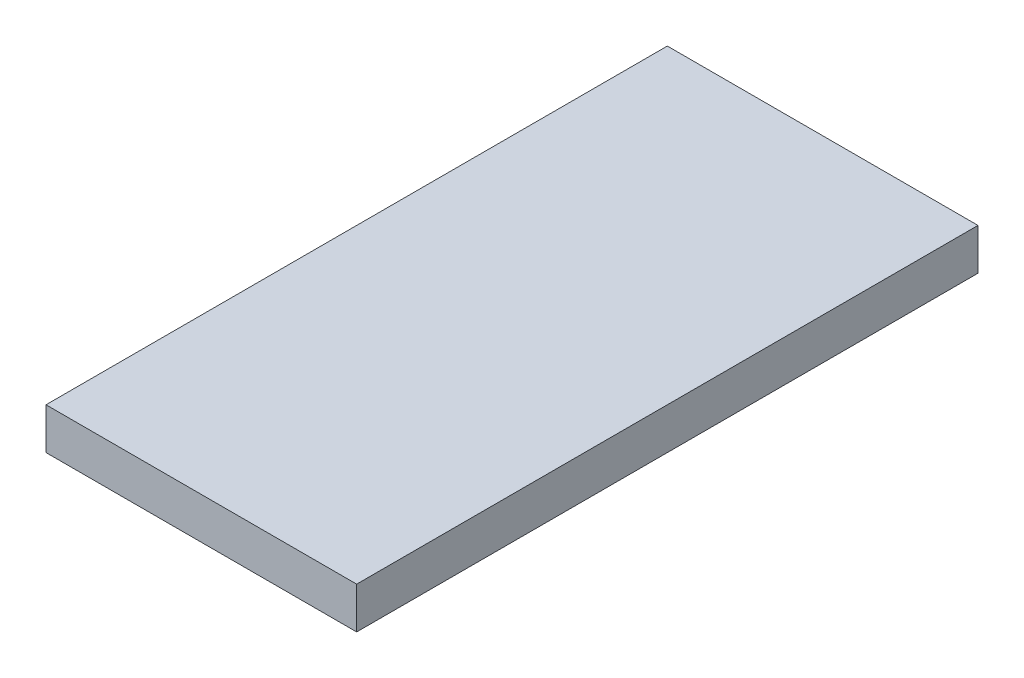
ISO-10303-21;
HEADER;
FILE_DESCRIPTION(('STEP AP214'),'2;1');
FILE_NAME('part.step','',(''),(''),'','','');
FILE_SCHEMA(('AUTOMOTIVE_DESIGN { 1 0 10303 214 1 1 1 1 }'));
ENDSEC;
DATA;
#1=APPLICATION_CONTEXT('core data for automotive mechanical design processes');
#2=APPLICATION_PROTOCOL_DEFINITION('international standard','automotive_design',2000,#1);
#3=PRODUCT_CONTEXT('',#1,'mechanical');
#4=PRODUCT('Part','Part','',(#3));
#5=PRODUCT_RELATED_PRODUCT_CATEGORY('part','',(#4));
#6=PRODUCT_DEFINITION_FORMATION('','',#4);
#7=PRODUCT_DEFINITION_CONTEXT('part definition',#1,'design');
#8=PRODUCT_DEFINITION('design','',#6,#7);
#9=PRODUCT_DEFINITION_SHAPE('','',#8);
#10=(LENGTH_UNIT() NAMED_UNIT(*) SI_UNIT(.MILLI.,.METRE.));
#11=(NAMED_UNIT(*) PLANE_ANGLE_UNIT() SI_UNIT($,.RADIAN.));
#12=(NAMED_UNIT(*) SI_UNIT($,.STERADIAN.) SOLID_ANGLE_UNIT());
#13=UNCERTAINTY_MEASURE_WITH_UNIT(LENGTH_MEASURE(1.E-05),#10,'distance_accuracy_value','');
#14=(GEOMETRIC_REPRESENTATION_CONTEXT(3) GLOBAL_UNCERTAINTY_ASSIGNED_CONTEXT((#13)) GLOBAL_UNIT_ASSIGNED_CONTEXT((#10,
#11,#12)) REPRESENTATION_CONTEXT('',''));
#15=CARTESIAN_POINT('',(0.,0.,0.));
#16=DIRECTION('',(0.,0.,1.));
#17=DIRECTION('',(1.,0.,0.));
#18=AXIS2_PLACEMENT_3D('',#15,#16,#17);
#19=CARTESIAN_POINT('',(0.,8.,120.));
#20=DIRECTION('',(1.,0.,0.));
#21=DIRECTION('',(0.,0.,-1.));
#22=AXIS2_PLACEMENT_3D('',#19,#20,#21);
#23=PLANE('',#22);
#24=DIRECTION('',(0.,-1.,0.));
#25=VECTOR('',#24,1.);
#26=CARTESIAN_POINT('',(0.,8.,0.));
#27=LINE('',#26,#25);
#28=CARTESIAN_POINT('',(0.,8.,0.));
#29=VERTEX_POINT('',#28);
#30=CARTESIAN_POINT('',(0.,0.,0.));
#31=VERTEX_POINT('',#30);
#32=EDGE_CURVE('E208',#29,#31,#27,.T.);
#33=ORIENTED_EDGE('',*,*,#32,.T.);
#34=DIRECTION('',(0.,0.,-1.));
#35=VECTOR('',#34,1.);
#36=CARTESIAN_POINT('',(0.,0.,120.));
#37=LINE('',#36,#35);
#38=CARTESIAN_POINT('',(0.,0.,120.));
#39=VERTEX_POINT('',#38);
#40=EDGE_CURVE('E11',#39,#31,#37,.T.);
#41=ORIENTED_EDGE('',*,*,#40,.F.);
#42=DIRECTION('',(0.,-1.,0.));
#43=VECTOR('',#42,1.);
#44=CARTESIAN_POINT('',(0.,8.,120.));
#45=LINE('',#44,#43);
#46=CARTESIAN_POINT('',(0.,8.,120.));
#47=VERTEX_POINT('',#46);
#48=EDGE_CURVE('E209',#47,#39,#45,.T.);
#49=ORIENTED_EDGE('',*,*,#48,.F.);
#50=DIRECTION('',(0.,0.,-1.));
#51=VECTOR('',#50,1.);
#52=CARTESIAN_POINT('',(0.,8.,120.));
#53=LINE('',#52,#51);
#54=EDGE_CURVE('E219',#47,#29,#53,.T.);
#55=ORIENTED_EDGE('',*,*,#54,.T.);
#56=EDGE_LOOP('',(#33,#41,#49,#55));
#57=FACE_BOUND('',#56,.T.);
#58=ADVANCED_FACE('F45',(#57),#23,.F.);
#59=CARTESIAN_POINT('',(0.,0.,120.));
#60=DIRECTION('',(0.,1.,0.));
#61=DIRECTION('',(0.,0.,1.));
#62=AXIS2_PLACEMENT_3D('',#59,#60,#61);
#63=PLANE('',#62);
#64=CARTESIAN_POINT('',(17.1014132027988,0.,20.));
#65=DIRECTION('',(0.,-1.,0.));
#66=DIRECTION('',(0.,0.,-1.));
#67=AXIS2_PLACEMENT_3D('',#64,#65,#66);
#68=CIRCLE('',#67,3.275);
#69=CARTESIAN_POINT('',(17.1014132027988,0.,16.725));
#70=VERTEX_POINT('',#69);
#71=EDGE_CURVE('E267',#70,#70,#68,.T.);
#72=ORIENTED_EDGE('',*,*,#71,.F.);
#73=EDGE_LOOP('',(#72));
#74=FACE_BOUND('',#73,.T.);
#75=CARTESIAN_POINT('',(17.1014132027985,0.,40.));
#76=DIRECTION('',(0.,-1.,0.));
#77=DIRECTION('',(0.,0.,-1.));
#78=AXIS2_PLACEMENT_3D('',#75,#76,#77);
#79=CIRCLE('',#78,3.275);
#80=CARTESIAN_POINT('',(17.1014132027985,0.,36.725));
#81=VERTEX_POINT('',#80);
#82=EDGE_CURVE('E120',#81,#81,#79,.T.);
#83=ORIENTED_EDGE('',*,*,#82,.F.);
#84=EDGE_LOOP('',(#83));
#85=FACE_BOUND('',#84,.T.);
#86=CARTESIAN_POINT('',(17.1014132027988,0.,60.));
#87=DIRECTION('',(0.,-1.,0.));
#88=DIRECTION('',(0.,0.,-1.));
#89=AXIS2_PLACEMENT_3D('',#86,#87,#88);
#90=CIRCLE('',#89,3.275);
#91=CARTESIAN_POINT('',(17.1014132027988,0.,56.725));
#92=VERTEX_POINT('',#91);
#93=EDGE_CURVE('E148',#92,#92,#90,.T.);
#94=ORIENTED_EDGE('',*,*,#93,.F.);
#95=EDGE_LOOP('',(#94));
#96=FACE_BOUND('',#95,.T.);
#97=CARTESIAN_POINT('',(17.1014132027985,0.,80.));
#98=DIRECTION('',(0.,-1.,0.));
#99=DIRECTION('',(0.,0.,-1.));
#100=AXIS2_PLACEMENT_3D('',#97,#98,#99);
#101=CIRCLE('',#100,3.275);
#102=CARTESIAN_POINT('',(17.1014132027985,0.,76.725));
#103=VERTEX_POINT('',#102);
#104=EDGE_CURVE('E168',#103,#103,#101,.T.);
#105=ORIENTED_EDGE('',*,*,#104,.F.);
#106=EDGE_LOOP('',(#105));
#107=FACE_BOUND('',#106,.T.);
#108=CARTESIAN_POINT('',(17.1014132027983,0.,100.));
#109=DIRECTION('',(0.,-1.,0.));
#110=DIRECTION('',(0.,0.,-1.));
#111=AXIS2_PLACEMENT_3D('',#108,#109,#110);
#112=CIRCLE('',#111,3.275);
#113=CARTESIAN_POINT('',(17.1014132027983,0.,96.725));
#114=VERTEX_POINT('',#113);
#115=EDGE_CURVE('E188',#114,#114,#112,.T.);
#116=ORIENTED_EDGE('',*,*,#115,.F.);
#117=EDGE_LOOP('',(#116));
#118=FACE_BOUND('',#117,.T.);
#119=DIRECTION('',(1.,0.,0.));
#120=VECTOR('',#119,1.);
#121=CARTESIAN_POINT('',(0.,0.,0.));
#122=LINE('',#121,#120);
#123=CARTESIAN_POINT('',(60.,0.,0.));
#124=VERTEX_POINT('',#123);
#125=EDGE_CURVE('E223',#31,#124,#122,.T.);
#126=ORIENTED_EDGE('',*,*,#125,.T.);
#127=DIRECTION('',(0.,0.,-1.));
#128=VECTOR('',#127,1.);
#129=CARTESIAN_POINT('',(60.,0.,120.));
#130=LINE('',#129,#128);
#131=CARTESIAN_POINT('',(60.,0.,120.));
#132=VERTEX_POINT('',#131);
#133=EDGE_CURVE('E54',#132,#124,#130,.T.);
#134=ORIENTED_EDGE('',*,*,#133,.F.);
#135=DIRECTION('',(1.,0.,0.));
#136=VECTOR('',#135,1.);
#137=CARTESIAN_POINT('',(0.,0.,120.));
#138=LINE('',#137,#136);
#139=EDGE_CURVE('E93',#39,#132,#138,.T.);
#140=ORIENTED_EDGE('',*,*,#139,.F.);
#141=ORIENTED_EDGE('',*,*,#40,.T.);
#142=EDGE_LOOP('',(#126,#134,#140,#141));
#143=FACE_BOUND('',#142,.T.);
#144=ADVANCED_FACE('F252',(#74,#85,#96,#107,#118,#143),#63,.F.);
#145=CARTESIAN_POINT('',(60.,0.,120.));
#146=DIRECTION('',(-1.,0.,0.));
#147=DIRECTION('',(0.,0.,1.));
#148=AXIS2_PLACEMENT_3D('',#145,#146,#147);
#149=PLANE('',#148);
#150=DIRECTION('',(0.,1.,0.));
#151=VECTOR('',#150,1.);
#152=CARTESIAN_POINT('',(60.,0.,0.));
#153=LINE('',#152,#151);
#154=CARTESIAN_POINT('',(60.,8.,0.));
#155=VERTEX_POINT('',#154);
#156=EDGE_CURVE('E80',#124,#155,#153,.T.);
#157=ORIENTED_EDGE('',*,*,#156,.T.);
#158=DIRECTION('',(0.,0.,-1.));
#159=VECTOR('',#158,1.);
#160=CARTESIAN_POINT('',(60.,8.,120.));
#161=LINE('',#160,#159);
#162=CARTESIAN_POINT('',(60.,8.,120.));
#163=VERTEX_POINT('',#162);
#164=EDGE_CURVE('E232',#163,#155,#161,.T.);
#165=ORIENTED_EDGE('',*,*,#164,.F.);
#166=DIRECTION('',(0.,1.,0.));
#167=VECTOR('',#166,1.);
#168=CARTESIAN_POINT('',(60.,0.,120.));
#169=LINE('',#168,#167);
#170=EDGE_CURVE('E214',#132,#163,#169,.T.);
#171=ORIENTED_EDGE('',*,*,#170,.F.);
#172=ORIENTED_EDGE('',*,*,#133,.T.);
#173=EDGE_LOOP('',(#157,#165,#171,#172));
#174=FACE_BOUND('',#173,.T.);
#175=ADVANCED_FACE('F236',(#174),#149,.F.);
#176=CARTESIAN_POINT('',(60.,8.,120.));
#177=DIRECTION('',(0.,-1.,0.));
#178=DIRECTION('',(0.,0.,-1.));
#179=AXIS2_PLACEMENT_3D('',#176,#177,#178);
#180=PLANE('',#179);
#181=DIRECTION('',(-1.,0.,0.));
#182=VECTOR('',#181,1.);
#183=CARTESIAN_POINT('',(60.,8.,0.));
#184=LINE('',#183,#182);
#185=EDGE_CURVE('E86',#155,#29,#184,.T.);
#186=ORIENTED_EDGE('',*,*,#185,.T.);
#187=ORIENTED_EDGE('',*,*,#54,.F.);
#188=DIRECTION('',(-1.,0.,0.));
#189=VECTOR('',#188,1.);
#190=CARTESIAN_POINT('',(60.,8.,120.));
#191=LINE('',#190,#189);
#192=EDGE_CURVE('E62',#163,#47,#191,.T.);
#193=ORIENTED_EDGE('',*,*,#192,.F.);
#194=ORIENTED_EDGE('',*,*,#164,.T.);
#195=EDGE_LOOP('',(#186,#187,#193,#194));
#196=FACE_BOUND('',#195,.T.);
#197=ADVANCED_FACE('F243',(#196),#180,.F.);
#198=CARTESIAN_POINT('',(0.,0.,120.));
#199=DIRECTION('',(0.,0.,1.));
#200=DIRECTION('',(1.,0.,0.));
#201=AXIS2_PLACEMENT_3D('',#198,#199,#200);
#202=PLANE('',#201);
#203=ORIENTED_EDGE('',*,*,#48,.T.);
#204=ORIENTED_EDGE('',*,*,#139,.T.);
#205=ORIENTED_EDGE('',*,*,#170,.T.);
#206=ORIENTED_EDGE('',*,*,#192,.T.);
#207=EDGE_LOOP('',(#203,#204,#205,#206));
#208=FACE_BOUND('',#207,.T.);
#209=ADVANCED_FACE('F245',(#208),#202,.T.);
#210=CARTESIAN_POINT('',(0.,0.,0.));
#211=DIRECTION('',(0.,0.,1.));
#212=DIRECTION('',(1.,0.,0.));
#213=AXIS2_PLACEMENT_3D('',#210,#211,#212);
#214=PLANE('',#213);
#215=ORIENTED_EDGE('',*,*,#32,.F.);
#216=ORIENTED_EDGE('',*,*,#185,.F.);
#217=ORIENTED_EDGE('',*,*,#156,.F.);
#218=ORIENTED_EDGE('',*,*,#125,.F.);
#219=EDGE_LOOP('',(#215,#216,#217,#218));
#220=FACE_BOUND('',#219,.T.);
#221=ADVANCED_FACE('F239',(#220),#214,.F.);
#222=CARTESIAN_POINT('',(17.1014132027983,6.,100.));
#223=DIRECTION('',(0.,-1.,0.));
#224=DIRECTION('',(0.,0.,-1.));
#225=AXIS2_PLACEMENT_3D('',#222,#223,#224);
#226=CONICAL_SURFACE('',#225,1.7,1.02974425867665);
#227=CARTESIAN_POINT('',(17.1014132027983,7.02146305234685,100.));
#228=VERTEX_POINT('',#227);
#229=VERTEX_LOOP('',#228);
#230=FACE_BOUND('',#229,.T.);
#231=CARTESIAN_POINT('',(17.1014132027983,6.,100.));
#232=DIRECTION('',(0.,-1.,0.));
#233=DIRECTION('',(0.,0.,-1.));
#234=AXIS2_PLACEMENT_3D('',#231,#232,#233);
#235=CIRCLE('',#234,1.7);
#236=CARTESIAN_POINT('',(17.1014132027983,6.,98.3));
#237=VERTEX_POINT('',#236);
#238=EDGE_CURVE('E204',#237,#237,#235,.T.);
#239=ORIENTED_EDGE('',*,*,#238,.T.);
#240=EDGE_LOOP('',(#239));
#241=FACE_BOUND('',#240,.T.);
#242=ADVANCED_FACE('F301',(#230,#241),#226,.F.);
#243=CARTESIAN_POINT('',(17.1014132027983,0.,100.));
#244=DIRECTION('',(0.,-1.,0.));
#245=DIRECTION('',(0.,0.,-1.));
#246=AXIS2_PLACEMENT_3D('',#243,#244,#245);
#247=CYLINDRICAL_SURFACE('',#246,1.7);
#248=ORIENTED_EDGE('',*,*,#238,.F.);
#249=EDGE_LOOP('',(#248));
#250=FACE_BOUND('',#249,.T.);
#251=CARTESIAN_POINT('',(17.1014132027983,3.4,100.));
#252=DIRECTION('',(0.,-1.,0.));
#253=DIRECTION('',(0.,0.,-1.));
#254=AXIS2_PLACEMENT_3D('',#251,#252,#253);
#255=CIRCLE('',#254,1.7);
#256=CARTESIAN_POINT('',(17.1014132027983,3.4,98.3));
#257=VERTEX_POINT('',#256);
#258=EDGE_CURVE('E200',#257,#257,#255,.T.);
#259=ORIENTED_EDGE('',*,*,#258,.T.);
#260=EDGE_LOOP('',(#259));
#261=FACE_BOUND('',#260,.T.);
#262=ADVANCED_FACE('F297',(#250,#261),#247,.F.);
#263=CARTESIAN_POINT('',(18.8014132027983,3.4,100.));
#264=DIRECTION('',(0.,1.,0.));
#265=DIRECTION('',(0.,0.,1.));
#266=AXIS2_PLACEMENT_3D('',#263,#264,#265);
#267=PLANE('',#266);
#268=ORIENTED_EDGE('',*,*,#258,.F.);
#269=EDGE_LOOP('',(#268));
#270=FACE_BOUND('',#269,.T.);
#271=CARTESIAN_POINT('',(17.1014132027983,3.4,100.));
#272=DIRECTION('',(0.,-1.,0.));
#273=DIRECTION('',(0.,0.,-1.));
#274=AXIS2_PLACEMENT_3D('',#271,#272,#273);
#275=CIRCLE('',#274,3.25);
#276=CARTESIAN_POINT('',(17.1014132027983,3.4,96.75));
#277=VERTEX_POINT('',#276);
#278=EDGE_CURVE('E196',#277,#277,#275,.T.);
#279=ORIENTED_EDGE('',*,*,#278,.T.);
#280=EDGE_LOOP('',(#279));
#281=FACE_BOUND('',#280,.T.);
#282=ADVANCED_FACE('F289',(#270,#281),#267,.F.);
#283=CARTESIAN_POINT('',(17.1014132027983,0.,100.));
#284=DIRECTION('',(0.,-1.,0.));
#285=DIRECTION('',(0.,0.,-1.));
#286=AXIS2_PLACEMENT_3D('',#283,#284,#285);
#287=CYLINDRICAL_SURFACE('',#286,3.25);
#288=ORIENTED_EDGE('',*,*,#278,.F.);
#289=EDGE_LOOP('',(#288));
#290=FACE_BOUND('',#289,.T.);
#291=CARTESIAN_POINT('',(17.1014132027983,0.0250000000000009,100.));
#292=DIRECTION('',(0.,-1.,0.));
#293=DIRECTION('',(0.,0.,-1.));
#294=AXIS2_PLACEMENT_3D('',#291,#292,#293);
#295=CIRCLE('',#294,3.25);
#296=CARTESIAN_POINT('',(17.1014132027983,0.0250000000000009,96.75));
#297=VERTEX_POINT('',#296);
#298=EDGE_CURVE('E192',#297,#297,#295,.T.);
#299=ORIENTED_EDGE('',*,*,#298,.T.);
#300=EDGE_LOOP('',(#299));
#301=FACE_BOUND('',#300,.T.);
#302=ADVANCED_FACE('F279',(#290,#301),#287,.F.);
#303=CARTESIAN_POINT('',(17.1014132027983,0.,100.));
#304=DIRECTION('',(0.,-1.,0.));
#305=DIRECTION('',(0.,0.,-1.));
#306=AXIS2_PLACEMENT_3D('',#303,#304,#305);
#307=CONICAL_SURFACE('',#306,3.275,0.785398163397444);
#308=ORIENTED_EDGE('',*,*,#298,.F.);
#309=EDGE_LOOP('',(#308));
#310=FACE_BOUND('',#309,.T.);
#311=ORIENTED_EDGE('',*,*,#115,.T.);
#312=EDGE_LOOP('',(#311));
#313=FACE_BOUND('',#312,.T.);
#314=ADVANCED_FACE('F276',(#310,#313),#307,.F.);
#315=CARTESIAN_POINT('',(17.1014132027985,6.,80.));
#316=DIRECTION('',(0.,-1.,0.));
#317=DIRECTION('',(0.,0.,-1.));
#318=AXIS2_PLACEMENT_3D('',#315,#316,#317);
#319=CONICAL_SURFACE('',#318,1.7,1.02974425867665);
#320=CARTESIAN_POINT('',(17.1014132027985,7.02146305234685,80.));
#321=VERTEX_POINT('',#320);
#322=VERTEX_LOOP('',#321);
#323=FACE_BOUND('',#322,.T.);
#324=CARTESIAN_POINT('',(17.1014132027985,6.,80.));
#325=DIRECTION('',(0.,-1.,0.));
#326=DIRECTION('',(0.,0.,-1.));
#327=AXIS2_PLACEMENT_3D('',#324,#325,#326);
#328=CIRCLE('',#327,1.7);
#329=CARTESIAN_POINT('',(17.1014132027985,6.,78.3));
#330=VERTEX_POINT('',#329);
#331=EDGE_CURVE('E184',#330,#330,#328,.T.);
#332=ORIENTED_EDGE('',*,*,#331,.T.);
#333=EDGE_LOOP('',(#332));
#334=FACE_BOUND('',#333,.T.);
#335=ADVANCED_FACE('F278',(#323,#334),#319,.F.);
#336=CARTESIAN_POINT('',(17.1014132027985,0.,80.));
#337=DIRECTION('',(0.,-1.,0.));
#338=DIRECTION('',(0.,0.,-1.));
#339=AXIS2_PLACEMENT_3D('',#336,#337,#338);
#340=CYLINDRICAL_SURFACE('',#339,1.7);
#341=ORIENTED_EDGE('',*,*,#331,.F.);
#342=EDGE_LOOP('',(#341));
#343=FACE_BOUND('',#342,.T.);
#344=CARTESIAN_POINT('',(17.1014132027985,3.4,80.));
#345=DIRECTION('',(0.,-1.,0.));
#346=DIRECTION('',(0.,0.,-1.));
#347=AXIS2_PLACEMENT_3D('',#344,#345,#346);
#348=CIRCLE('',#347,1.7);
#349=CARTESIAN_POINT('',(17.1014132027985,3.4,78.3));
#350=VERTEX_POINT('',#349);
#351=EDGE_CURVE('E180',#350,#350,#348,.T.);
#352=ORIENTED_EDGE('',*,*,#351,.T.);
#353=EDGE_LOOP('',(#352));
#354=FACE_BOUND('',#353,.T.);
#355=ADVANCED_FACE('F286',(#343,#354),#340,.F.);
#356=CARTESIAN_POINT('',(18.8014132027985,3.4,80.));
#357=DIRECTION('',(0.,1.,0.));
#358=DIRECTION('',(0.,0.,1.));
#359=AXIS2_PLACEMENT_3D('',#356,#357,#358);
#360=PLANE('',#359);
#361=ORIENTED_EDGE('',*,*,#351,.F.);
#362=EDGE_LOOP('',(#361));
#363=FACE_BOUND('',#362,.T.);
#364=CARTESIAN_POINT('',(17.1014132027985,3.4,80.));
#365=DIRECTION('',(0.,-1.,0.));
#366=DIRECTION('',(0.,0.,-1.));
#367=AXIS2_PLACEMENT_3D('',#364,#365,#366);
#368=CIRCLE('',#367,3.25);
#369=CARTESIAN_POINT('',(17.1014132027985,3.4,76.75));
#370=VERTEX_POINT('',#369);
#371=EDGE_CURVE('E176',#370,#370,#368,.T.);
#372=ORIENTED_EDGE('',*,*,#371,.T.);
#373=EDGE_LOOP('',(#372));
#374=FACE_BOUND('',#373,.T.);
#375=ADVANCED_FACE('F368',(#363,#374),#360,.F.);
#376=CARTESIAN_POINT('',(17.1014132027985,0.,80.));
#377=DIRECTION('',(0.,-1.,0.));
#378=DIRECTION('',(0.,0.,-1.));
#379=AXIS2_PLACEMENT_3D('',#376,#377,#378);
#380=CYLINDRICAL_SURFACE('',#379,3.25);
#381=ORIENTED_EDGE('',*,*,#371,.F.);
#382=EDGE_LOOP('',(#381));
#383=FACE_BOUND('',#382,.T.);
#384=CARTESIAN_POINT('',(17.1014132027985,0.0250000000000009,80.));
#385=DIRECTION('',(0.,-1.,0.));
#386=DIRECTION('',(0.,0.,-1.));
#387=AXIS2_PLACEMENT_3D('',#384,#385,#386);
#388=CIRCLE('',#387,3.25);
#389=CARTESIAN_POINT('',(17.1014132027985,0.0250000000000009,76.75));
#390=VERTEX_POINT('',#389);
#391=EDGE_CURVE('E172',#390,#390,#388,.T.);
#392=ORIENTED_EDGE('',*,*,#391,.T.);
#393=EDGE_LOOP('',(#392));
#394=FACE_BOUND('',#393,.T.);
#395=ADVANCED_FACE('F376',(#383,#394),#380,.F.);
#396=CARTESIAN_POINT('',(17.1014132027985,0.,80.));
#397=DIRECTION('',(0.,-1.,0.));
#398=DIRECTION('',(0.,0.,-1.));
#399=AXIS2_PLACEMENT_3D('',#396,#397,#398);
#400=CONICAL_SURFACE('',#399,3.275,0.785398163397444);
#401=ORIENTED_EDGE('',*,*,#391,.F.);
#402=EDGE_LOOP('',(#401));
#403=FACE_BOUND('',#402,.T.);
#404=ORIENTED_EDGE('',*,*,#104,.T.);
#405=EDGE_LOOP('',(#404));
#406=FACE_BOUND('',#405,.T.);
#407=ADVANCED_FACE('F385',(#403,#406),#400,.F.);
#408=CARTESIAN_POINT('',(17.1014132027988,6.,60.));
#409=DIRECTION('',(0.,-1.,0.));
#410=DIRECTION('',(0.,0.,-1.));
#411=AXIS2_PLACEMENT_3D('',#408,#409,#410);
#412=CONICAL_SURFACE('',#411,1.7,1.02974425867665);
#413=CARTESIAN_POINT('',(17.1014132027988,7.02146305234685,60.));
#414=VERTEX_POINT('',#413);
#415=VERTEX_LOOP('',#414);
#416=FACE_BOUND('',#415,.T.);
#417=CARTESIAN_POINT('',(17.1014132027988,6.,60.));
#418=DIRECTION('',(0.,-1.,0.));
#419=DIRECTION('',(0.,0.,-1.));
#420=AXIS2_PLACEMENT_3D('',#417,#418,#419);
#421=CIRCLE('',#420,1.7);
#422=CARTESIAN_POINT('',(17.1014132027988,6.,58.3));
#423=VERTEX_POINT('',#422);
#424=EDGE_CURVE('E164',#423,#423,#421,.T.);
#425=ORIENTED_EDGE('',*,*,#424,.T.);
#426=EDGE_LOOP('',(#425));
#427=FACE_BOUND('',#426,.T.);
#428=ADVANCED_FACE('F394',(#416,#427),#412,.F.);
#429=CARTESIAN_POINT('',(17.1014132027988,0.,60.));
#430=DIRECTION('',(0.,-1.,0.));
#431=DIRECTION('',(0.,0.,-1.));
#432=AXIS2_PLACEMENT_3D('',#429,#430,#431);
#433=CYLINDRICAL_SURFACE('',#432,1.7);
#434=ORIENTED_EDGE('',*,*,#424,.F.);
#435=EDGE_LOOP('',(#434));
#436=FACE_BOUND('',#435,.T.);
#437=CARTESIAN_POINT('',(17.1014132027988,3.4,60.));
#438=DIRECTION('',(0.,-1.,0.));
#439=DIRECTION('',(0.,0.,-1.));
#440=AXIS2_PLACEMENT_3D('',#437,#438,#439);
#441=CIRCLE('',#440,1.7);
#442=CARTESIAN_POINT('',(17.1014132027988,3.4,58.3));
#443=VERTEX_POINT('',#442);
#444=EDGE_CURVE('E160',#443,#443,#441,.T.);
#445=ORIENTED_EDGE('',*,*,#444,.T.);
#446=EDGE_LOOP('',(#445));
#447=FACE_BOUND('',#446,.T.);
#448=ADVANCED_FACE('F403',(#436,#447),#433,.F.);
#449=CARTESIAN_POINT('',(18.8014132027988,3.4,60.));
#450=DIRECTION('',(0.,1.,0.));
#451=DIRECTION('',(0.,0.,1.));
#452=AXIS2_PLACEMENT_3D('',#449,#450,#451);
#453=PLANE('',#452);
#454=ORIENTED_EDGE('',*,*,#444,.F.);
#455=EDGE_LOOP('',(#454));
#456=FACE_BOUND('',#455,.T.);
#457=CARTESIAN_POINT('',(17.1014132027988,3.4,60.));
#458=DIRECTION('',(0.,-1.,0.));
#459=DIRECTION('',(0.,0.,-1.));
#460=AXIS2_PLACEMENT_3D('',#457,#458,#459);
#461=CIRCLE('',#460,3.25);
#462=CARTESIAN_POINT('',(17.1014132027988,3.4,56.75));
#463=VERTEX_POINT('',#462);
#464=EDGE_CURVE('E156',#463,#463,#461,.T.);
#465=ORIENTED_EDGE('',*,*,#464,.T.);
#466=EDGE_LOOP('',(#465));
#467=FACE_BOUND('',#466,.T.);
#468=ADVANCED_FACE('F412',(#456,#467),#453,.F.);
#469=CARTESIAN_POINT('',(17.1014132027988,0.,60.));
#470=DIRECTION('',(0.,-1.,0.));
#471=DIRECTION('',(0.,0.,-1.));
#472=AXIS2_PLACEMENT_3D('',#469,#470,#471);
#473=CYLINDRICAL_SURFACE('',#472,3.25);
#474=ORIENTED_EDGE('',*,*,#464,.F.);
#475=EDGE_LOOP('',(#474));
#476=FACE_BOUND('',#475,.T.);
#477=CARTESIAN_POINT('',(17.1014132027988,0.0250000000000009,60.));
#478=DIRECTION('',(0.,-1.,0.));
#479=DIRECTION('',(0.,0.,-1.));
#480=AXIS2_PLACEMENT_3D('',#477,#478,#479);
#481=CIRCLE('',#480,3.25);
#482=CARTESIAN_POINT('',(17.1014132027988,0.0250000000000009,56.75));
#483=VERTEX_POINT('',#482);
#484=EDGE_CURVE('E152',#483,#483,#481,.T.);
#485=ORIENTED_EDGE('',*,*,#484,.T.);
#486=EDGE_LOOP('',(#485));
#487=FACE_BOUND('',#486,.T.);
#488=ADVANCED_FACE('F421',(#476,#487),#473,.F.);
#489=CARTESIAN_POINT('',(17.1014132027988,0.,60.));
#490=DIRECTION('',(0.,-1.,0.));
#491=DIRECTION('',(0.,0.,-1.));
#492=AXIS2_PLACEMENT_3D('',#489,#490,#491);
#493=CONICAL_SURFACE('',#492,3.275,0.785398163397444);
#494=ORIENTED_EDGE('',*,*,#484,.F.);
#495=EDGE_LOOP('',(#494));
#496=FACE_BOUND('',#495,.T.);
#497=ORIENTED_EDGE('',*,*,#93,.T.);
#498=EDGE_LOOP('',(#497));
#499=FACE_BOUND('',#498,.T.);
#500=ADVANCED_FACE('F430',(#496,#499),#493,.F.);
#501=CARTESIAN_POINT('',(17.1014132027985,6.,40.));
#502=DIRECTION('',(0.,-1.,0.));
#503=DIRECTION('',(0.,0.,-1.));
#504=AXIS2_PLACEMENT_3D('',#501,#502,#503);
#505=CONICAL_SURFACE('',#504,1.7,1.02974425867665);
#506=CARTESIAN_POINT('',(17.1014132027985,7.02146305234685,40.));
#507=VERTEX_POINT('',#506);
#508=VERTEX_LOOP('',#507);
#509=FACE_BOUND('',#508,.T.);
#510=CARTESIAN_POINT('',(17.1014132027985,6.,40.));
#511=DIRECTION('',(0.,-1.,0.));
#512=DIRECTION('',(0.,0.,-1.));
#513=AXIS2_PLACEMENT_3D('',#510,#511,#512);
#514=CIRCLE('',#513,1.7);
#515=CARTESIAN_POINT('',(17.1014132027985,6.,38.3));
#516=VERTEX_POINT('',#515);
#517=EDGE_CURVE('E144',#516,#516,#514,.T.);
#518=ORIENTED_EDGE('',*,*,#517,.T.);
#519=EDGE_LOOP('',(#518));
#520=FACE_BOUND('',#519,.T.);
#521=ADVANCED_FACE('F439',(#509,#520),#505,.F.);
#522=CARTESIAN_POINT('',(17.1014132027985,0.,40.));
#523=DIRECTION('',(0.,-1.,0.));
#524=DIRECTION('',(0.,0.,-1.));
#525=AXIS2_PLACEMENT_3D('',#522,#523,#524);
#526=CYLINDRICAL_SURFACE('',#525,1.7);
#527=ORIENTED_EDGE('',*,*,#517,.F.);
#528=EDGE_LOOP('',(#527));
#529=FACE_BOUND('',#528,.T.);
#530=CARTESIAN_POINT('',(17.1014132027985,3.4,40.));
#531=DIRECTION('',(0.,-1.,0.));
#532=DIRECTION('',(0.,0.,-1.));
#533=AXIS2_PLACEMENT_3D('',#530,#531,#532);
#534=CIRCLE('',#533,1.7);
#535=CARTESIAN_POINT('',(17.1014132027985,3.4,38.3));
#536=VERTEX_POINT('',#535);
#537=EDGE_CURVE('E140',#536,#536,#534,.T.);
#538=ORIENTED_EDGE('',*,*,#537,.T.);
#539=EDGE_LOOP('',(#538));
#540=FACE_BOUND('',#539,.T.);
#541=ADVANCED_FACE('F448',(#529,#540),#526,.F.);
#542=CARTESIAN_POINT('',(18.8014132027985,3.4,40.));
#543=DIRECTION('',(0.,1.,0.));
#544=DIRECTION('',(0.,0.,1.));
#545=AXIS2_PLACEMENT_3D('',#542,#543,#544);
#546=PLANE('',#545);
#547=ORIENTED_EDGE('',*,*,#537,.F.);
#548=EDGE_LOOP('',(#547));
#549=FACE_BOUND('',#548,.T.);
#550=CARTESIAN_POINT('',(17.1014132027985,3.4,40.));
#551=DIRECTION('',(0.,-1.,0.));
#552=DIRECTION('',(0.,0.,-1.));
#553=AXIS2_PLACEMENT_3D('',#550,#551,#552);
#554=CIRCLE('',#553,3.25);
#555=CARTESIAN_POINT('',(17.1014132027985,3.4,36.75));
#556=VERTEX_POINT('',#555);
#557=EDGE_CURVE('E136',#556,#556,#554,.T.);
#558=ORIENTED_EDGE('',*,*,#557,.T.);
#559=EDGE_LOOP('',(#558));
#560=FACE_BOUND('',#559,.T.);
#561=ADVANCED_FACE('F457',(#549,#560),#546,.F.);
#562=CARTESIAN_POINT('',(17.1014132027985,0.,40.));
#563=DIRECTION('',(0.,-1.,0.));
#564=DIRECTION('',(0.,0.,-1.));
#565=AXIS2_PLACEMENT_3D('',#562,#563,#564);
#566=CYLINDRICAL_SURFACE('',#565,3.25);
#567=ORIENTED_EDGE('',*,*,#557,.F.);
#568=EDGE_LOOP('',(#567));
#569=FACE_BOUND('',#568,.T.);
#570=CARTESIAN_POINT('',(17.1014132027985,0.0250000000000009,40.));
#571=DIRECTION('',(0.,-1.,0.));
#572=DIRECTION('',(0.,0.,-1.));
#573=AXIS2_PLACEMENT_3D('',#570,#571,#572);
#574=CIRCLE('',#573,3.25);
#575=CARTESIAN_POINT('',(17.1014132027985,0.0250000000000009,36.75));
#576=VERTEX_POINT('',#575);
#577=EDGE_CURVE('E126',#576,#576,#574,.T.);
#578=ORIENTED_EDGE('',*,*,#577,.T.);
#579=EDGE_LOOP('',(#578));
#580=FACE_BOUND('',#579,.T.);
#581=ADVANCED_FACE('F466',(#569,#580),#566,.F.);
#582=CARTESIAN_POINT('',(17.1014132027985,0.,40.));
#583=DIRECTION('',(0.,-1.,0.));
#584=DIRECTION('',(0.,0.,-1.));
#585=AXIS2_PLACEMENT_3D('',#582,#583,#584);
#586=CONICAL_SURFACE('',#585,3.275,0.785398163397444);
#587=ORIENTED_EDGE('',*,*,#577,.F.);
#588=EDGE_LOOP('',(#587));
#589=FACE_BOUND('',#588,.T.);
#590=ORIENTED_EDGE('',*,*,#82,.T.);
#591=EDGE_LOOP('',(#590));
#592=FACE_BOUND('',#591,.T.);
#593=ADVANCED_FACE('F113',(#589,#592),#586,.F.);
#594=CARTESIAN_POINT('',(17.1014132027988,6.,20.));
#595=DIRECTION('',(0.,-1.,0.));
#596=DIRECTION('',(0.,0.,-1.));
#597=AXIS2_PLACEMENT_3D('',#594,#595,#596);
#598=CONICAL_SURFACE('',#597,1.7,1.02974425867665);
#599=CARTESIAN_POINT('',(17.1014132027988,7.02146305234685,20.));
#600=VERTEX_POINT('',#599);
#601=VERTEX_LOOP('',#600);
#602=FACE_BOUND('',#601,.T.);
#603=CARTESIAN_POINT('',(17.1014132027988,6.,20.));
#604=DIRECTION('',(0.,-1.,0.));
#605=DIRECTION('',(0.,0.,-1.));
#606=AXIS2_PLACEMENT_3D('',#603,#604,#605);
#607=CIRCLE('',#606,1.7);
#608=CARTESIAN_POINT('',(17.1014132027988,6.,18.3));
#609=VERTEX_POINT('',#608);
#610=EDGE_CURVE('E117',#609,#609,#607,.T.);
#611=ORIENTED_EDGE('',*,*,#610,.T.);
#612=EDGE_LOOP('',(#611));
#613=FACE_BOUND('',#612,.T.);
#614=ADVANCED_FACE('F109',(#602,#613),#598,.F.);
#615=CARTESIAN_POINT('',(17.1014132027988,0.,20.));
#616=DIRECTION('',(0.,-1.,0.));
#617=DIRECTION('',(0.,0.,-1.));
#618=AXIS2_PLACEMENT_3D('',#615,#616,#617);
#619=CYLINDRICAL_SURFACE('',#618,1.7);
#620=ORIENTED_EDGE('',*,*,#610,.F.);
#621=EDGE_LOOP('',(#620));
#622=FACE_BOUND('',#621,.T.);
#623=CARTESIAN_POINT('',(17.1014132027988,3.4,20.));
#624=DIRECTION('',(0.,-1.,0.));
#625=DIRECTION('',(0.,0.,-1.));
#626=AXIS2_PLACEMENT_3D('',#623,#624,#625);
#627=CIRCLE('',#626,1.7);
#628=CARTESIAN_POINT('',(17.1014132027988,3.4,18.3));
#629=VERTEX_POINT('',#628);
#630=EDGE_CURVE('E121',#629,#629,#627,.T.);
#631=ORIENTED_EDGE('',*,*,#630,.T.);
#632=EDGE_LOOP('',(#631));
#633=FACE_BOUND('',#632,.T.);
#634=ADVANCED_FACE('F112',(#622,#633),#619,.F.);
#635=CARTESIAN_POINT('',(18.8014132027988,3.4,20.));
#636=DIRECTION('',(0.,1.,0.));
#637=DIRECTION('',(0.,0.,1.));
#638=AXIS2_PLACEMENT_3D('',#635,#636,#637);
#639=PLANE('',#638);
#640=ORIENTED_EDGE('',*,*,#630,.F.);
#641=EDGE_LOOP('',(#640));
#642=FACE_BOUND('',#641,.T.);
#643=CARTESIAN_POINT('',(17.1014132027988,3.4,20.));
#644=DIRECTION('',(0.,-1.,0.));
#645=DIRECTION('',(0.,0.,-1.));
#646=AXIS2_PLACEMENT_3D('',#643,#644,#645);
#647=CIRCLE('',#646,3.25);
#648=CARTESIAN_POINT('',(17.1014132027988,3.4,16.75));
#649=VERTEX_POINT('',#648);
#650=EDGE_CURVE('E129',#649,#649,#647,.T.);
#651=ORIENTED_EDGE('',*,*,#650,.T.);
#652=EDGE_LOOP('',(#651));
#653=FACE_BOUND('',#652,.T.);
#654=ADVANCED_FACE('F496',(#642,#653),#639,.F.);
#655=CARTESIAN_POINT('',(17.1014132027988,0.,20.));
#656=DIRECTION('',(0.,-1.,0.));
#657=DIRECTION('',(0.,0.,-1.));
#658=AXIS2_PLACEMENT_3D('',#655,#656,#657);
#659=CYLINDRICAL_SURFACE('',#658,3.25);
#660=ORIENTED_EDGE('',*,*,#650,.F.);
#661=EDGE_LOOP('',(#660));
#662=FACE_BOUND('',#661,.T.);
#663=CARTESIAN_POINT('',(17.1014132027988,0.0250000000000009,20.));
#664=DIRECTION('',(0.,-1.,0.));
#665=DIRECTION('',(0.,0.,-1.));
#666=AXIS2_PLACEMENT_3D('',#663,#664,#665);
#667=CIRCLE('',#666,3.25);
#668=CARTESIAN_POINT('',(17.1014132027988,0.0250000000000009,16.75));
#669=VERTEX_POINT('',#668);
#670=EDGE_CURVE('E548',#669,#669,#667,.T.);
#671=ORIENTED_EDGE('',*,*,#670,.T.);
#672=EDGE_LOOP('',(#671));
#673=FACE_BOUND('',#672,.T.);
#674=ADVANCED_FACE('F504',(#662,#673),#659,.F.);
#675=CARTESIAN_POINT('',(17.1014132027988,0.,20.));
#676=DIRECTION('',(0.,-1.,0.));
#677=DIRECTION('',(0.,0.,-1.));
#678=AXIS2_PLACEMENT_3D('',#675,#676,#677);
#679=CONICAL_SURFACE('',#678,3.275,0.785398163397444);
#680=ORIENTED_EDGE('',*,*,#670,.F.);
#681=EDGE_LOOP('',(#680));
#682=FACE_BOUND('',#681,.T.);
#683=ORIENTED_EDGE('',*,*,#71,.T.);
#684=EDGE_LOOP('',(#683));
#685=FACE_BOUND('',#684,.T.);
#686=ADVANCED_FACE('F513',(#682,#685),#679,.F.);
#687=CLOSED_SHELL('',(#58,#144,#175,#197,#209,#221,#242,#262,#282,#302,#314,#335,#355,#375,#395,
#407,#428,#448,#468,#488,#500,#521,#541,#561,#581,#593,#614,#634,#654,#674,#686));
#688=MANIFOLD_SOLID_BREP('B2',#687);
#689=ADVANCED_BREP_SHAPE_REPRESENTATION('',(#18,#688),#14);
#690=SHAPE_DEFINITION_REPRESENTATION(#9,#689);
ENDSEC;
END-ISO-10303-21;
